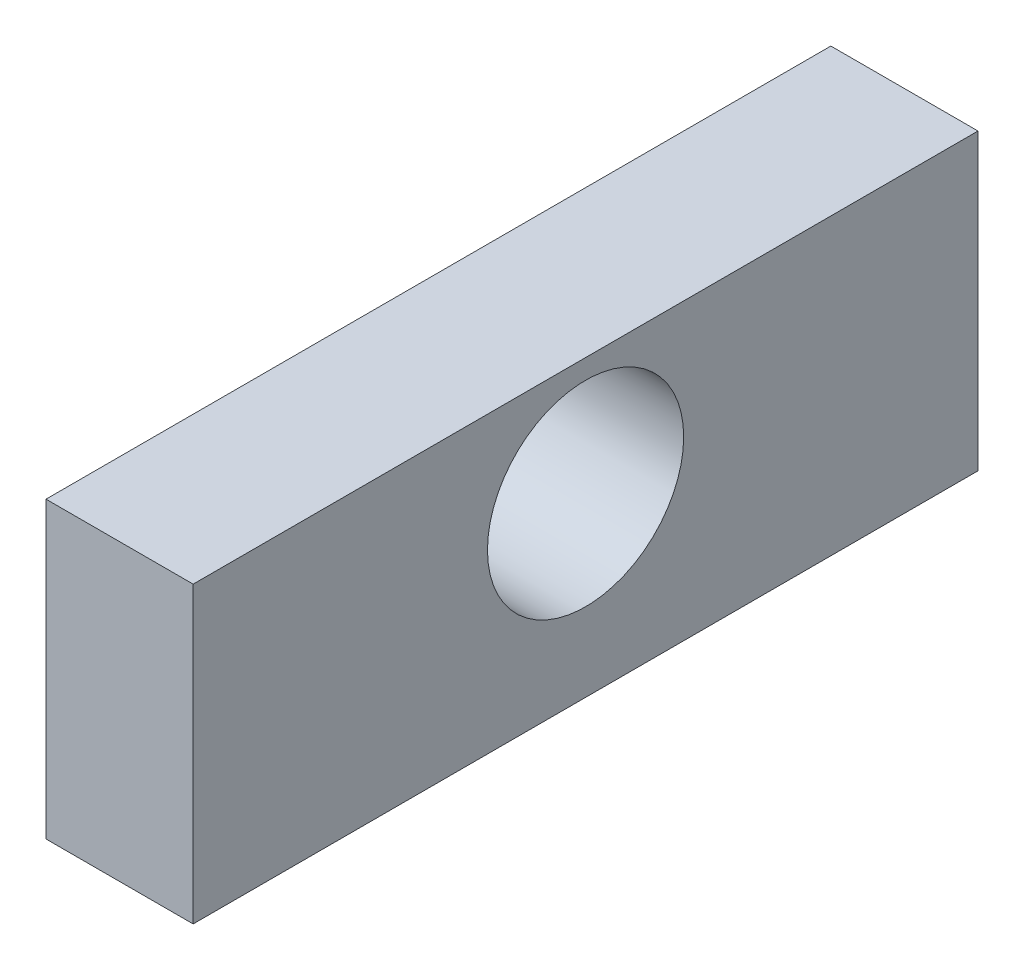
ISO-10303-21;
HEADER;
FILE_DESCRIPTION(('STEP AP214'),'2;1');
FILE_NAME('part.step','',(''),(''),'','','');
FILE_SCHEMA(('AUTOMOTIVE_DESIGN { 1 0 10303 214 1 1 1 1 }'));
ENDSEC;
DATA;
#1=APPLICATION_CONTEXT('core data for automotive mechanical design processes');
#2=APPLICATION_PROTOCOL_DEFINITION('international standard','automotive_design',2000,#1);
#3=PRODUCT_CONTEXT('',#1,'mechanical');
#4=PRODUCT('Part','Part','',(#3));
#5=PRODUCT_RELATED_PRODUCT_CATEGORY('part','',(#4));
#6=PRODUCT_DEFINITION_FORMATION('','',#4);
#7=PRODUCT_DEFINITION_CONTEXT('part definition',#1,'design');
#8=PRODUCT_DEFINITION('design','',#6,#7);
#9=PRODUCT_DEFINITION_SHAPE('','',#8);
#10=(LENGTH_UNIT() NAMED_UNIT(*) SI_UNIT(.MILLI.,.METRE.));
#11=(NAMED_UNIT(*) PLANE_ANGLE_UNIT() SI_UNIT($,.RADIAN.));
#12=(NAMED_UNIT(*) SI_UNIT($,.STERADIAN.) SOLID_ANGLE_UNIT());
#13=UNCERTAINTY_MEASURE_WITH_UNIT(LENGTH_MEASURE(1.E-05),#10,'distance_accuracy_value','');
#14=(GEOMETRIC_REPRESENTATION_CONTEXT(3) GLOBAL_UNCERTAINTY_ASSIGNED_CONTEXT((#13)) GLOBAL_UNIT_ASSIGNED_CONTEXT((#10,
#11,#12)) REPRESENTATION_CONTEXT('',''));
#15=CARTESIAN_POINT('',(0.,0.,0.));
#16=DIRECTION('',(0.,0.,1.));
#17=DIRECTION('',(1.,0.,0.));
#18=AXIS2_PLACEMENT_3D('',#15,#16,#17);
#19=CARTESIAN_POINT('',(9.525,-9.525,-25.4));
#20=DIRECTION('',(0.,0.,1.));
#21=DIRECTION('',(1.,0.,0.));
#22=AXIS2_PLACEMENT_3D('',#19,#20,#21);
#23=PLANE('',#22);
#24=CARTESIAN_POINT('',(4.7625,-3.175,-25.4));
#25=DIRECTION('',(0.,0.,-1.));
#26=DIRECTION('',(-1.,0.,0.));
#27=AXIS2_PLACEMENT_3D('',#24,#25,#26);
#28=CIRCLE('',#27,2.0193);
#29=CARTESIAN_POINT('',(2.7432,-3.175,-25.4));
#30=VERTEX_POINT('',#29);
#31=EDGE_CURVE('E102',#30,#30,#28,.T.);
#32=ORIENTED_EDGE('',*,*,#31,.F.);
#33=EDGE_LOOP('',(#32));
#34=FACE_BOUND('',#33,.T.);
#35=CARTESIAN_POINT('',(4.7625,5.715,-25.4));
#36=DIRECTION('',(0.,0.,-1.));
#37=DIRECTION('',(-1.,0.,0.));
#38=AXIS2_PLACEMENT_3D('',#35,#36,#37);
#39=CIRCLE('',#38,2.0193);
#40=CARTESIAN_POINT('',(2.7432,5.715,-25.4));
#41=VERTEX_POINT('',#40);
#42=EDGE_CURVE('E101',#41,#41,#39,.T.);
#43=ORIENTED_EDGE('',*,*,#42,.F.);
#44=EDGE_LOOP('',(#43));
#45=FACE_BOUND('',#44,.T.);
#46=DIRECTION('',(0.,1.,0.));
#47=VECTOR('',#46,1.);
#48=CARTESIAN_POINT('',(0.,-9.525,-25.4));
#49=LINE('',#48,#47);
#50=CARTESIAN_POINT('',(0.,-9.525,-25.4));
#51=VERTEX_POINT('',#50);
#52=CARTESIAN_POINT('',(0.,9.525,-25.4));
#53=VERTEX_POINT('',#52);
#54=EDGE_CURVE('E118',#51,#53,#49,.T.);
#55=ORIENTED_EDGE('',*,*,#54,.T.);
#56=DIRECTION('',(-1.,0.,0.));
#57=VECTOR('',#56,1.);
#58=CARTESIAN_POINT('',(9.525,9.525,-25.4));
#59=LINE('',#58,#57);
#60=CARTESIAN_POINT('',(9.525,9.525,-25.4));
#61=VERTEX_POINT('',#60);
#62=EDGE_CURVE('E11',#61,#53,#59,.T.);
#63=ORIENTED_EDGE('',*,*,#62,.F.);
#64=DIRECTION('',(0.,1.,0.));
#65=VECTOR('',#64,1.);
#66=CARTESIAN_POINT('',(9.525,-9.525,-25.4));
#67=LINE('',#66,#65);
#68=CARTESIAN_POINT('',(9.525,-9.525,-25.4));
#69=VERTEX_POINT('',#68);
#70=EDGE_CURVE('E119',#69,#61,#67,.T.);
#71=ORIENTED_EDGE('',*,*,#70,.F.);
#72=DIRECTION('',(-1.,0.,0.));
#73=VECTOR('',#72,1.);
#74=CARTESIAN_POINT('',(9.525,-9.525,-25.4));
#75=LINE('',#74,#73);
#76=EDGE_CURVE('E125',#69,#51,#75,.T.);
#77=ORIENTED_EDGE('',*,*,#76,.T.);
#78=EDGE_LOOP('',(#55,#63,#71,#77));
#79=FACE_BOUND('',#78,.T.);
#80=ADVANCED_FACE('F37',(#34,#45,#79),#23,.F.);
#81=CARTESIAN_POINT('',(9.525,9.525,25.4));
#82=DIRECTION('',(0.,-1.,0.));
#83=DIRECTION('',(0.,0.,-1.));
#84=AXIS2_PLACEMENT_3D('',#81,#82,#83);
#85=PLANE('',#84);
#86=DIRECTION('',(0.,0.,1.));
#87=VECTOR('',#86,1.);
#88=CARTESIAN_POINT('',(0.,9.525,25.4));
#89=LINE('',#88,#87);
#90=CARTESIAN_POINT('',(0.,9.525,25.4));
#91=VERTEX_POINT('',#90);
#92=EDGE_CURVE('E128',#53,#91,#89,.T.);
#93=ORIENTED_EDGE('',*,*,#92,.T.);
#94=DIRECTION('',(-1.,0.,0.));
#95=VECTOR('',#94,1.);
#96=CARTESIAN_POINT('',(9.525,9.525,25.4));
#97=LINE('',#96,#95);
#98=CARTESIAN_POINT('',(9.525,9.525,25.4));
#99=VERTEX_POINT('',#98);
#100=EDGE_CURVE('E45',#99,#91,#97,.T.);
#101=ORIENTED_EDGE('',*,*,#100,.F.);
#102=DIRECTION('',(0.,0.,1.));
#103=VECTOR('',#102,1.);
#104=CARTESIAN_POINT('',(9.525,9.525,25.4));
#105=LINE('',#104,#103);
#106=EDGE_CURVE('E84',#61,#99,#105,.T.);
#107=ORIENTED_EDGE('',*,*,#106,.F.);
#108=ORIENTED_EDGE('',*,*,#62,.T.);
#109=EDGE_LOOP('',(#93,#101,#107,#108));
#110=FACE_BOUND('',#109,.T.);
#111=ADVANCED_FACE('F152',(#110),#85,.F.);
#112=CARTESIAN_POINT('',(9.525,-9.525,25.4));
#113=DIRECTION('',(0.,0.,-1.));
#114=DIRECTION('',(-1.,0.,0.));
#115=AXIS2_PLACEMENT_3D('',#112,#113,#114);
#116=PLANE('',#115);
#117=DIRECTION('',(0.,-1.,0.));
#118=VECTOR('',#117,1.);
#119=CARTESIAN_POINT('',(0.,-9.525,25.4));
#120=LINE('',#119,#118);
#121=CARTESIAN_POINT('',(0.,-9.525,25.4));
#122=VERTEX_POINT('',#121);
#123=EDGE_CURVE('E71',#91,#122,#120,.T.);
#124=ORIENTED_EDGE('',*,*,#123,.T.);
#125=DIRECTION('',(-1.,0.,0.));
#126=VECTOR('',#125,1.);
#127=CARTESIAN_POINT('',(9.525,-9.525,25.4));
#128=LINE('',#127,#126);
#129=CARTESIAN_POINT('',(9.525,-9.525,25.4));
#130=VERTEX_POINT('',#129);
#131=EDGE_CURVE('E133',#130,#122,#128,.T.);
#132=ORIENTED_EDGE('',*,*,#131,.F.);
#133=DIRECTION('',(0.,-1.,0.));
#134=VECTOR('',#133,1.);
#135=CARTESIAN_POINT('',(9.525,-9.525,25.4));
#136=LINE('',#135,#134);
#137=EDGE_CURVE('E122',#99,#130,#136,.T.);
#138=ORIENTED_EDGE('',*,*,#137,.F.);
#139=ORIENTED_EDGE('',*,*,#100,.T.);
#140=EDGE_LOOP('',(#124,#132,#138,#139));
#141=FACE_BOUND('',#140,.T.);
#142=ADVANCED_FACE('F135',(#141),#116,.F.);
#143=CARTESIAN_POINT('',(9.525,-9.525,25.4));
#144=DIRECTION('',(0.,1.,0.));
#145=DIRECTION('',(0.,0.,1.));
#146=AXIS2_PLACEMENT_3D('',#143,#144,#145);
#147=PLANE('',#146);
#148=DIRECTION('',(0.,0.,-1.));
#149=VECTOR('',#148,1.);
#150=CARTESIAN_POINT('',(0.,-9.525,25.4));
#151=LINE('',#150,#149);
#152=EDGE_CURVE('E77',#122,#51,#151,.T.);
#153=ORIENTED_EDGE('',*,*,#152,.T.);
#154=ORIENTED_EDGE('',*,*,#76,.F.);
#155=DIRECTION('',(0.,0.,-1.));
#156=VECTOR('',#155,1.);
#157=CARTESIAN_POINT('',(9.525,-9.525,25.4));
#158=LINE('',#157,#156);
#159=EDGE_CURVE('E53',#130,#69,#158,.T.);
#160=ORIENTED_EDGE('',*,*,#159,.F.);
#161=ORIENTED_EDGE('',*,*,#131,.T.);
#162=EDGE_LOOP('',(#153,#154,#160,#161));
#163=FACE_BOUND('',#162,.T.);
#164=ADVANCED_FACE('F142',(#163),#147,.F.);
#165=CARTESIAN_POINT('',(9.525,0.,0.));
#166=DIRECTION('',(-1.,0.,0.));
#167=DIRECTION('',(0.,0.,1.));
#168=AXIS2_PLACEMENT_3D('',#165,#166,#167);
#169=PLANE('',#168);
#170=CARTESIAN_POINT('',(9.525,1.905,0.));
#171=DIRECTION('',(1.,0.,0.));
#172=DIRECTION('',(0.,0.,-1.));
#173=AXIS2_PLACEMENT_3D('',#170,#171,#172);
#174=CIRCLE('',#173,6.34999999999999);
#175=CARTESIAN_POINT('',(9.525,1.905,-6.34999999999999));
#176=VERTEX_POINT('',#175);
#177=EDGE_CURVE('E112',#176,#176,#174,.T.);
#178=ORIENTED_EDGE('',*,*,#177,.F.);
#179=EDGE_LOOP('',(#178));
#180=FACE_BOUND('',#179,.T.);
#181=ORIENTED_EDGE('',*,*,#70,.T.);
#182=ORIENTED_EDGE('',*,*,#106,.T.);
#183=ORIENTED_EDGE('',*,*,#137,.T.);
#184=ORIENTED_EDGE('',*,*,#159,.T.);
#185=EDGE_LOOP('',(#181,#182,#183,#184));
#186=FACE_BOUND('',#185,.T.);
#187=ADVANCED_FACE('F144',(#180,#186),#169,.F.);
#188=CARTESIAN_POINT('',(0.,0.,0.));
#189=DIRECTION('',(-1.,0.,0.));
#190=DIRECTION('',(0.,0.,1.));
#191=AXIS2_PLACEMENT_3D('',#188,#189,#190);
#192=PLANE('',#191);
#193=CARTESIAN_POINT('',(0.,1.905,0.));
#194=DIRECTION('',(-1.,0.,0.));
#195=DIRECTION('',(0.,0.,1.));
#196=AXIS2_PLACEMENT_3D('',#193,#194,#195);
#197=CIRCLE('',#196,6.34999999999999);
#198=CARTESIAN_POINT('',(0.,1.905,6.34999999999998));
#199=VERTEX_POINT('',#198);
#200=EDGE_CURVE('E115',#199,#199,#197,.T.);
#201=ORIENTED_EDGE('',*,*,#200,.F.);
#202=EDGE_LOOP('',(#201));
#203=FACE_BOUND('',#202,.T.);
#204=ORIENTED_EDGE('',*,*,#54,.F.);
#205=ORIENTED_EDGE('',*,*,#152,.F.);
#206=ORIENTED_EDGE('',*,*,#123,.F.);
#207=ORIENTED_EDGE('',*,*,#92,.F.);
#208=EDGE_LOOP('',(#204,#205,#206,#207));
#209=FACE_BOUND('',#208,.T.);
#210=ADVANCED_FACE('F138',(#203,#209),#192,.T.);
#211=CARTESIAN_POINT('',(9.525,1.905,0.));
#212=DIRECTION('',(1.,0.,0.));
#213=DIRECTION('',(0.,0.,-1.));
#214=AXIS2_PLACEMENT_3D('',#211,#212,#213);
#215=CYLINDRICAL_SURFACE('',#214,6.34999999999999);
#216=ORIENTED_EDGE('',*,*,#200,.T.);
#217=EDGE_LOOP('',(#216));
#218=FACE_BOUND('',#217,.T.);
#219=ORIENTED_EDGE('',*,*,#177,.T.);
#220=EDGE_LOOP('',(#219));
#221=FACE_BOUND('',#220,.T.);
#222=ADVANCED_FACE('F171',(#218,#221),#215,.F.);
#223=CARTESIAN_POINT('',(4.7625,5.715,-13.462));
#224=DIRECTION('',(0.,0.,-1.));
#225=DIRECTION('',(-1.,0.,0.));
#226=AXIS2_PLACEMENT_3D('',#223,#224,#225);
#227=CONICAL_SURFACE('',#226,2.0193,1.02974425867665);
#228=CARTESIAN_POINT('',(4.7625,5.715,-12.2486821519977));
#229=VERTEX_POINT('',#228);
#230=VERTEX_LOOP('',#229);
#231=FACE_BOUND('',#230,.T.);
#232=CARTESIAN_POINT('',(4.7625,5.715,-13.462));
#233=DIRECTION('',(0.,0.,-1.));
#234=DIRECTION('',(-1.,0.,0.));
#235=AXIS2_PLACEMENT_3D('',#232,#233,#234);
#236=CIRCLE('',#235,2.0193);
#237=CARTESIAN_POINT('',(2.7432,5.715,-13.462));
#238=VERTEX_POINT('',#237);
#239=EDGE_CURVE('E105',#238,#238,#236,.T.);
#240=ORIENTED_EDGE('',*,*,#239,.T.);
#241=EDGE_LOOP('',(#240));
#242=FACE_BOUND('',#241,.T.);
#243=ADVANCED_FACE('F165',(#231,#242),#227,.F.);
#244=CARTESIAN_POINT('',(4.7625,5.715,-25.4));
#245=DIRECTION('',(0.,0.,-1.));
#246=DIRECTION('',(-1.,0.,0.));
#247=AXIS2_PLACEMENT_3D('',#244,#245,#246);
#248=CYLINDRICAL_SURFACE('',#247,2.0193);
#249=ORIENTED_EDGE('',*,*,#239,.F.);
#250=EDGE_LOOP('',(#249));
#251=FACE_BOUND('',#250,.T.);
#252=ORIENTED_EDGE('',*,*,#42,.T.);
#253=EDGE_LOOP('',(#252));
#254=FACE_BOUND('',#253,.T.);
#255=ADVANCED_FACE('F95',(#251,#254),#248,.F.);
#256=CARTESIAN_POINT('',(4.7625,-3.175,-13.462));
#257=DIRECTION('',(0.,0.,-1.));
#258=DIRECTION('',(-1.,0.,0.));
#259=AXIS2_PLACEMENT_3D('',#256,#257,#258);
#260=CONICAL_SURFACE('',#259,2.0193,1.02974425867665);
#261=CARTESIAN_POINT('',(4.7625,-3.175,-12.2486821519977));
#262=VERTEX_POINT('',#261);
#263=VERTEX_LOOP('',#262);
#264=FACE_BOUND('',#263,.T.);
#265=CARTESIAN_POINT('',(4.7625,-3.175,-13.462));
#266=DIRECTION('',(0.,0.,-1.));
#267=DIRECTION('',(-1.,0.,0.));
#268=AXIS2_PLACEMENT_3D('',#265,#266,#267);
#269=CIRCLE('',#268,2.0193);
#270=CARTESIAN_POINT('',(2.7432,-3.175,-13.462));
#271=VERTEX_POINT('',#270);
#272=EDGE_CURVE('E99',#271,#271,#269,.T.);
#273=ORIENTED_EDGE('',*,*,#272,.T.);
#274=EDGE_LOOP('',(#273));
#275=FACE_BOUND('',#274,.T.);
#276=ADVANCED_FACE('F91',(#264,#275),#260,.F.);
#277=CARTESIAN_POINT('',(4.7625,-3.175,-25.4));
#278=DIRECTION('',(0.,0.,-1.));
#279=DIRECTION('',(-1.,0.,0.));
#280=AXIS2_PLACEMENT_3D('',#277,#278,#279);
#281=CYLINDRICAL_SURFACE('',#280,2.0193);
#282=ORIENTED_EDGE('',*,*,#272,.F.);
#283=EDGE_LOOP('',(#282));
#284=FACE_BOUND('',#283,.T.);
#285=ORIENTED_EDGE('',*,*,#31,.T.);
#286=EDGE_LOOP('',(#285));
#287=FACE_BOUND('',#286,.T.);
#288=ADVANCED_FACE('F94',(#284,#287),#281,.F.);
#289=CLOSED_SHELL('',(#80,#111,#142,#164,#187,#210,#222,#243,#255,#276,#288));
#290=MANIFOLD_SOLID_BREP('B2',#289);
#291=ADVANCED_BREP_SHAPE_REPRESENTATION('',(#18,#290),#14);
#292=SHAPE_DEFINITION_REPRESENTATION(#9,#291);
ENDSEC;
END-ISO-10303-21;
